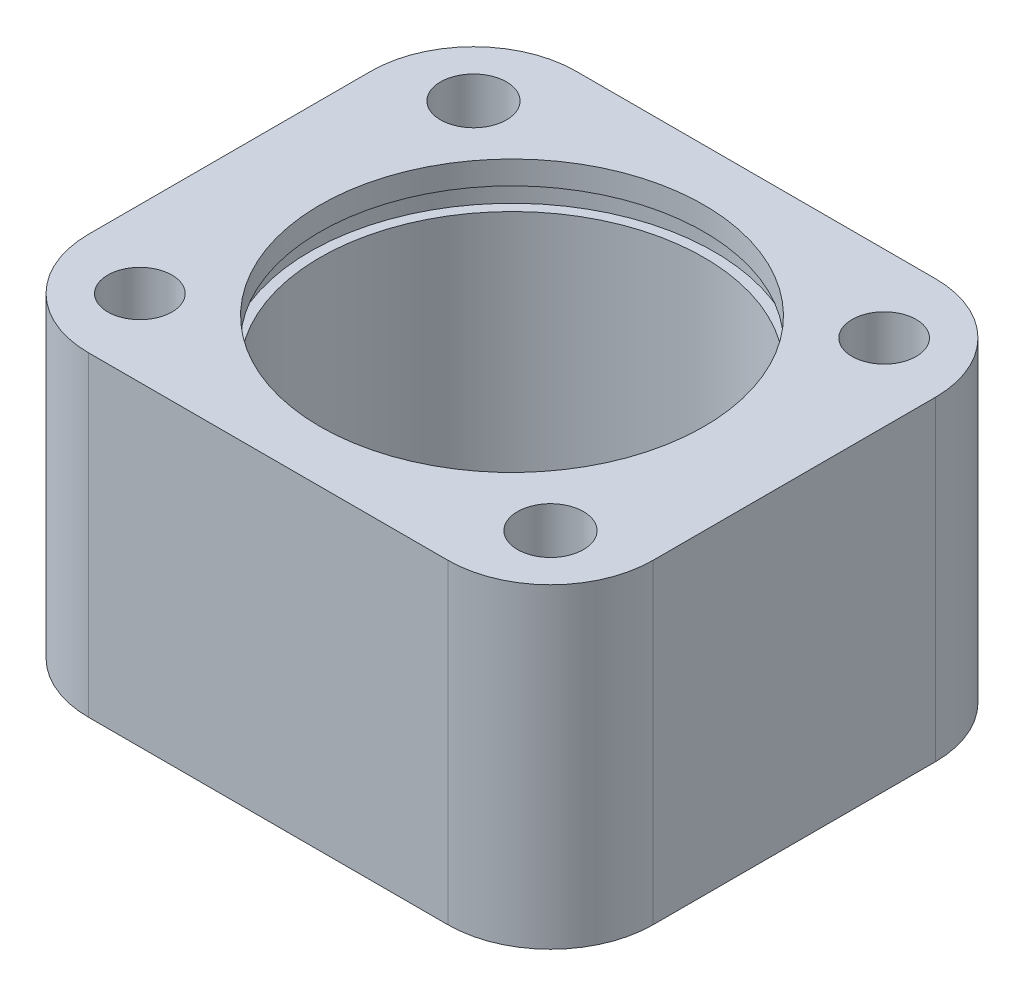
ISO-10303-21;
HEADER;
FILE_DESCRIPTION(('STEP AP214'),'2;1');
FILE_NAME('part.step','',(''),(''),'','','');
FILE_SCHEMA(('AUTOMOTIVE_DESIGN { 1 0 10303 214 1 1 1 1 }'));
ENDSEC;
DATA;
#1=APPLICATION_CONTEXT('core data for automotive mechanical design processes');
#2=APPLICATION_PROTOCOL_DEFINITION('international standard','automotive_design',2000,#1);
#3=PRODUCT_CONTEXT('',#1,'mechanical');
#4=PRODUCT('Part','Part','',(#3));
#5=PRODUCT_RELATED_PRODUCT_CATEGORY('part','',(#4));
#6=PRODUCT_DEFINITION_FORMATION('','',#4);
#7=PRODUCT_DEFINITION_CONTEXT('part definition',#1,'design');
#8=PRODUCT_DEFINITION('design','',#6,#7);
#9=PRODUCT_DEFINITION_SHAPE('','',#8);
#10=(LENGTH_UNIT() NAMED_UNIT(*) SI_UNIT(.MILLI.,.METRE.));
#11=(NAMED_UNIT(*) PLANE_ANGLE_UNIT() SI_UNIT($,.RADIAN.));
#12=(NAMED_UNIT(*) SI_UNIT($,.STERADIAN.) SOLID_ANGLE_UNIT());
#13=UNCERTAINTY_MEASURE_WITH_UNIT(LENGTH_MEASURE(1.E-05),#10,'distance_accuracy_value','');
#14=(GEOMETRIC_REPRESENTATION_CONTEXT(3) GLOBAL_UNCERTAINTY_ASSIGNED_CONTEXT((#13)) GLOBAL_UNIT_ASSIGNED_CONTEXT((#10,
#11,#12)) REPRESENTATION_CONTEXT('',''));
#15=CARTESIAN_POINT('',(0.,0.,0.));
#16=DIRECTION('',(0.,0.,1.));
#17=DIRECTION('',(1.,0.,0.));
#18=AXIS2_PLACEMENT_3D('',#15,#16,#17);
#19=CARTESIAN_POINT('',(0.,-34.6794263142389,0.));
#20=DIRECTION('',(0.,1.,0.));
#21=DIRECTION('',(0.,0.,1.));
#22=AXIS2_PLACEMENT_3D('',#19,#20,#21);
#23=CYLINDRICAL_SURFACE('',#22,9.4996);
#24=CARTESIAN_POINT('',(0.,-6.5405,0.));
#25=DIRECTION('',(0.,1.,0.));
#26=DIRECTION('',(0.,0.,1.));
#27=AXIS2_PLACEMENT_3D('',#24,#25,#26);
#28=CIRCLE('',#27,9.4996);
#29=CARTESIAN_POINT('',(0.,-6.5405,9.4996));
#30=VERTEX_POINT('',#29);
#31=EDGE_CURVE('E226',#30,#30,#28,.F.);
#32=ORIENTED_EDGE('',*,*,#31,.T.);
#33=EDGE_LOOP('',(#32));
#34=FACE_BOUND('',#33,.T.);
#35=CARTESIAN_POINT('',(0.,5.5595,0.));
#36=DIRECTION('',(0.,1.,0.));
#37=DIRECTION('',(0.,0.,1.));
#38=AXIS2_PLACEMENT_3D('',#35,#36,#37);
#39=CIRCLE('',#38,9.4996);
#40=CARTESIAN_POINT('',(0.,5.5595,9.4996));
#41=VERTEX_POINT('',#40);
#42=EDGE_CURVE('E168',#41,#41,#39,.F.);
#43=ORIENTED_EDGE('',*,*,#42,.F.);
#44=EDGE_LOOP('',(#43));
#45=FACE_BOUND('',#44,.T.);
#46=ADVANCED_FACE('F39',(#34,#45),#23,.F.);
#47=CARTESIAN_POINT('',(13.97,-7.8105,12.065));
#48=DIRECTION('',(-1.,0.,0.));
#49=DIRECTION('',(0.,0.,1.));
#50=AXIS2_PLACEMENT_3D('',#47,#48,#49);
#51=PLANE('',#50);
#52=DIRECTION('',(0.,0.,-1.));
#53=VECTOR('',#52,1.);
#54=CARTESIAN_POINT('',(13.97,-7.8105,12.065));
#55=LINE('',#54,#53);
#56=CARTESIAN_POINT('',(13.97,-7.8105,6.985));
#57=VERTEX_POINT('',#56);
#58=CARTESIAN_POINT('',(13.97,-7.8105,-6.98499999999999));
#59=VERTEX_POINT('',#58);
#60=EDGE_CURVE('E129',#57,#59,#55,.T.);
#61=ORIENTED_EDGE('',*,*,#60,.T.);
#62=DIRECTION('',(0.,1.,0.));
#63=VECTOR('',#62,1.);
#64=CARTESIAN_POINT('',(13.97,7.8105,-6.985));
#65=LINE('',#64,#63);
#66=CARTESIAN_POINT('',(13.97,7.8105,-6.98499999999999));
#67=VERTEX_POINT('',#66);
#68=EDGE_CURVE('E156',#59,#67,#65,.T.);
#69=ORIENTED_EDGE('',*,*,#68,.T.);
#70=DIRECTION('',(0.,0.,-1.));
#71=VECTOR('',#70,1.);
#72=CARTESIAN_POINT('',(13.97,7.8105,12.065));
#73=LINE('',#72,#71);
#74=CARTESIAN_POINT('',(13.97,7.8105,6.985));
#75=VERTEX_POINT('',#74);
#76=EDGE_CURVE('E133',#75,#67,#73,.T.);
#77=ORIENTED_EDGE('',*,*,#76,.F.);
#78=DIRECTION('',(0.,1.,0.));
#79=VECTOR('',#78,1.);
#80=CARTESIAN_POINT('',(13.97,-7.8105,6.985));
#81=LINE('',#80,#79);
#82=EDGE_CURVE('E154',#75,#57,#81,.F.);
#83=ORIENTED_EDGE('',*,*,#82,.T.);
#84=EDGE_LOOP('',(#61,#69,#77,#83));
#85=FACE_BOUND('',#84,.T.);
#86=ADVANCED_FACE('F254',(#85),#51,.F.);
#87=CARTESIAN_POINT('',(-13.97,7.8105,12.065));
#88=DIRECTION('',(0.,-1.,0.));
#89=DIRECTION('',(0.,0.,-1.));
#90=AXIS2_PLACEMENT_3D('',#87,#88,#89);
#91=PLANE('',#90);
#92=CARTESIAN_POINT('',(-10.16,7.8105,8.255));
#93=DIRECTION('',(0.,-1.,0.));
#94=DIRECTION('',(0.,0.,-1.));
#95=AXIS2_PLACEMENT_3D('',#92,#93,#94);
#96=CIRCLE('',#95,1.5875);
#97=CARTESIAN_POINT('',(-10.16,7.8105,6.6675));
#98=VERTEX_POINT('',#97);
#99=EDGE_CURVE('E162',#98,#98,#96,.T.);
#100=ORIENTED_EDGE('',*,*,#99,.T.);
#101=EDGE_LOOP('',(#100));
#102=FACE_BOUND('',#101,.T.);
#103=CARTESIAN_POINT('',(10.16,7.8105,-8.255));
#104=DIRECTION('',(0.,-1.,0.));
#105=DIRECTION('',(0.,0.,-1.));
#106=AXIS2_PLACEMENT_3D('',#103,#104,#105);
#107=CIRCLE('',#106,1.5875);
#108=CARTESIAN_POINT('',(10.16,7.8105,-9.8425));
#109=VERTEX_POINT('',#108);
#110=EDGE_CURVE('E193',#109,#109,#107,.T.);
#111=ORIENTED_EDGE('',*,*,#110,.T.);
#112=EDGE_LOOP('',(#111));
#113=FACE_BOUND('',#112,.T.);
#114=CARTESIAN_POINT('',(10.16,7.8105,8.255));
#115=DIRECTION('',(0.,-1.,0.));
#116=DIRECTION('',(0.,0.,-1.));
#117=AXIS2_PLACEMENT_3D('',#114,#115,#116);
#118=CIRCLE('',#117,1.63195);
#119=CARTESIAN_POINT('',(10.16,7.8105,6.62305));
#120=VERTEX_POINT('',#119);
#121=EDGE_CURVE('E205',#120,#120,#118,.T.);
#122=ORIENTED_EDGE('',*,*,#121,.T.);
#123=EDGE_LOOP('',(#122));
#124=FACE_BOUND('',#123,.T.);
#125=CARTESIAN_POINT('',(-10.16,7.8105,-8.255));
#126=DIRECTION('',(0.,-1.,0.));
#127=DIRECTION('',(0.,0.,-1.));
#128=AXIS2_PLACEMENT_3D('',#125,#126,#127);
#129=CIRCLE('',#128,1.63195);
#130=CARTESIAN_POINT('',(-10.16,7.8105,-9.88695));
#131=VERTEX_POINT('',#130);
#132=EDGE_CURVE('E217',#131,#131,#129,.T.);
#133=ORIENTED_EDGE('',*,*,#132,.T.);
#134=EDGE_LOOP('',(#133));
#135=FACE_BOUND('',#134,.T.);
#136=CARTESIAN_POINT('',(0.,7.8105,0.));
#137=DIRECTION('',(0.,1.,0.));
#138=DIRECTION('',(0.,0.,1.));
#139=AXIS2_PLACEMENT_3D('',#136,#137,#138);
#140=CIRCLE('',#139,9.4996);
#141=CARTESIAN_POINT('',(0.,7.8105,9.4996));
#142=VERTEX_POINT('',#141);
#143=EDGE_CURVE('E223',#142,#142,#140,.T.);
#144=ORIENTED_EDGE('',*,*,#143,.F.);
#145=EDGE_LOOP('',(#144));
#146=FACE_BOUND('',#145,.T.);
#147=DIRECTION('',(-1.,0.,0.));
#148=VECTOR('',#147,1.);
#149=CARTESIAN_POINT('',(-13.97,7.8105,-12.065));
#150=LINE('',#149,#148);
#151=CARTESIAN_POINT('',(8.89,7.8105,-12.065));
#152=VERTEX_POINT('',#151);
#153=CARTESIAN_POINT('',(-8.89,7.8105,-12.065));
#154=VERTEX_POINT('',#153);
#155=EDGE_CURVE('E229',#152,#154,#150,.T.);
#156=ORIENTED_EDGE('',*,*,#155,.T.);
#157=CARTESIAN_POINT('',(-8.89,7.8105,-6.985));
#158=DIRECTION('',(0.,-1.,0.));
#159=DIRECTION('',(0.,0.,-1.));
#160=AXIS2_PLACEMENT_3D('',#157,#158,#159);
#161=CIRCLE('',#160,5.08);
#162=CARTESIAN_POINT('',(-13.97,7.8105,-6.98499999999999));
#163=VERTEX_POINT('',#162);
#164=EDGE_CURVE('E152',#154,#163,#161,.F.);
#165=ORIENTED_EDGE('',*,*,#164,.T.);
#166=DIRECTION('',(0.,0.,-1.));
#167=VECTOR('',#166,1.);
#168=CARTESIAN_POINT('',(-13.97,7.8105,12.065));
#169=LINE('',#168,#167);
#170=CARTESIAN_POINT('',(-13.97,7.8105,6.985));
#171=VERTEX_POINT('',#170);
#172=EDGE_CURVE('E128',#171,#163,#169,.T.);
#173=ORIENTED_EDGE('',*,*,#172,.F.);
#174=CARTESIAN_POINT('',(-8.89,7.8105,6.985));
#175=DIRECTION('',(0.,-1.,0.));
#176=DIRECTION('',(0.,0.,-1.));
#177=AXIS2_PLACEMENT_3D('',#174,#175,#176);
#178=CIRCLE('',#177,5.08);
#179=CARTESIAN_POINT('',(-8.89,7.8105,12.065));
#180=VERTEX_POINT('',#179);
#181=EDGE_CURVE('E132',#171,#180,#178,.F.);
#182=ORIENTED_EDGE('',*,*,#181,.T.);
#183=DIRECTION('',(-1.,0.,0.));
#184=VECTOR('',#183,1.);
#185=CARTESIAN_POINT('',(-13.97,7.8105,12.065));
#186=LINE('',#185,#184);
#187=CARTESIAN_POINT('',(8.89,7.8105,12.065));
#188=VERTEX_POINT('',#187);
#189=EDGE_CURVE('E230',#188,#180,#186,.T.);
#190=ORIENTED_EDGE('',*,*,#189,.F.);
#191=CARTESIAN_POINT('',(8.89,7.8105,6.985));
#192=DIRECTION('',(0.,-1.,0.));
#193=DIRECTION('',(0.,0.,-1.));
#194=AXIS2_PLACEMENT_3D('',#191,#192,#193);
#195=CIRCLE('',#194,5.08);
#196=EDGE_CURVE('E64',#188,#75,#195,.F.);
#197=ORIENTED_EDGE('',*,*,#196,.T.);
#198=ORIENTED_EDGE('',*,*,#76,.T.);
#199=CARTESIAN_POINT('',(8.89,7.8105,-6.985));
#200=DIRECTION('',(0.,-1.,0.));
#201=DIRECTION('',(0.,0.,-1.));
#202=AXIS2_PLACEMENT_3D('',#199,#200,#201);
#203=CIRCLE('',#202,5.08);
#204=EDGE_CURVE('E56',#67,#152,#203,.F.);
#205=ORIENTED_EDGE('',*,*,#204,.T.);
#206=EDGE_LOOP('',(#156,#165,#173,#182,#190,#197,#198,#205));
#207=FACE_BOUND('',#206,.T.);
#208=ADVANCED_FACE('F261',(#102,#113,#124,#135,#146,#207),#91,.F.);
#209=CARTESIAN_POINT('',(-13.97,-7.8105,12.065));
#210=DIRECTION('',(1.,0.,0.));
#211=DIRECTION('',(0.,0.,-1.));
#212=AXIS2_PLACEMENT_3D('',#209,#210,#211);
#213=PLANE('',#212);
#214=ORIENTED_EDGE('',*,*,#172,.T.);
#215=DIRECTION('',(0.,-1.,0.));
#216=VECTOR('',#215,1.);
#217=CARTESIAN_POINT('',(-13.97,-7.8105,-6.985));
#218=LINE('',#217,#216);
#219=CARTESIAN_POINT('',(-13.97,-7.8105,-6.98499999999999));
#220=VERTEX_POINT('',#219);
#221=EDGE_CURVE('E119',#163,#220,#218,.T.);
#222=ORIENTED_EDGE('',*,*,#221,.T.);
#223=DIRECTION('',(0.,0.,-1.));
#224=VECTOR('',#223,1.);
#225=CARTESIAN_POINT('',(-13.97,-7.8105,12.065));
#226=LINE('',#225,#224);
#227=CARTESIAN_POINT('',(-13.97,-7.8105,6.985));
#228=VERTEX_POINT('',#227);
#229=EDGE_CURVE('E111',#228,#220,#226,.T.);
#230=ORIENTED_EDGE('',*,*,#229,.F.);
#231=DIRECTION('',(0.,-1.,0.));
#232=VECTOR('',#231,1.);
#233=CARTESIAN_POINT('',(-13.97,-7.8105,6.985));
#234=LINE('',#233,#232);
#235=EDGE_CURVE('E125',#228,#171,#234,.F.);
#236=ORIENTED_EDGE('',*,*,#235,.T.);
#237=EDGE_LOOP('',(#214,#222,#230,#236));
#238=FACE_BOUND('',#237,.T.);
#239=ADVANCED_FACE('F124',(#238),#213,.F.);
#240=CARTESIAN_POINT('',(-13.97,-7.8105,12.065));
#241=DIRECTION('',(0.,1.,0.));
#242=DIRECTION('',(0.,0.,1.));
#243=AXIS2_PLACEMENT_3D('',#240,#241,#242);
#244=PLANE('',#243);
#245=CARTESIAN_POINT('',(-10.16,-7.8105,8.255));
#246=DIRECTION('',(0.,-1.,0.));
#247=DIRECTION('',(0.,0.,-1.));
#248=AXIS2_PLACEMENT_3D('',#245,#246,#247);
#249=CIRCLE('',#248,1.98437499999999);
#250=CARTESIAN_POINT('',(-10.16,-7.8105,6.27062500000001));
#251=VERTEX_POINT('',#250);
#252=EDGE_CURVE('E174',#251,#251,#249,.T.);
#253=ORIENTED_EDGE('',*,*,#252,.F.);
#254=EDGE_LOOP('',(#253));
#255=FACE_BOUND('',#254,.T.);
#256=CARTESIAN_POINT('',(10.16,-7.8105,-8.255));
#257=DIRECTION('',(0.,-1.,0.));
#258=DIRECTION('',(0.,0.,-1.));
#259=AXIS2_PLACEMENT_3D('',#256,#257,#258);
#260=CIRCLE('',#259,1.98437499999999);
#261=CARTESIAN_POINT('',(10.16,-7.8105,-10.239375));
#262=VERTEX_POINT('',#261);
#263=EDGE_CURVE('E166',#262,#262,#260,.T.);
#264=ORIENTED_EDGE('',*,*,#263,.F.);
#265=EDGE_LOOP('',(#264));
#266=FACE_BOUND('',#265,.T.);
#267=CARTESIAN_POINT('',(10.16,-7.8105,8.255));
#268=DIRECTION('',(0.,-1.,0.));
#269=DIRECTION('',(0.,0.,-1.));
#270=AXIS2_PLACEMENT_3D('',#267,#268,#269);
#271=CIRCLE('',#270,2.77875999999999);
#272=CARTESIAN_POINT('',(10.16,-7.8105,5.47624000000001));
#273=VERTEX_POINT('',#272);
#274=EDGE_CURVE('E196',#273,#273,#271,.T.);
#275=ORIENTED_EDGE('',*,*,#274,.F.);
#276=EDGE_LOOP('',(#275));
#277=FACE_BOUND('',#276,.T.);
#278=CARTESIAN_POINT('',(-10.16,-7.8105,-8.255));
#279=DIRECTION('',(0.,-1.,0.));
#280=DIRECTION('',(0.,0.,-1.));
#281=AXIS2_PLACEMENT_3D('',#278,#279,#280);
#282=CIRCLE('',#281,2.77875999999999);
#283=CARTESIAN_POINT('',(-10.16,-7.8105,-11.03376));
#284=VERTEX_POINT('',#283);
#285=EDGE_CURVE('E208',#284,#284,#282,.T.);
#286=ORIENTED_EDGE('',*,*,#285,.F.);
#287=EDGE_LOOP('',(#286));
#288=FACE_BOUND('',#287,.T.);
#289=CARTESIAN_POINT('',(0.,-7.8105,0.));
#290=DIRECTION('',(0.,1.,0.));
#291=DIRECTION('',(0.,0.,1.));
#292=AXIS2_PLACEMENT_3D('',#289,#290,#291);
#293=CIRCLE('',#292,7.50062);
#294=CARTESIAN_POINT('',(0.,-7.8105,7.50062));
#295=VERTEX_POINT('',#294);
#296=EDGE_CURVE('E220',#295,#295,#293,.T.);
#297=ORIENTED_EDGE('',*,*,#296,.T.);
#298=EDGE_LOOP('',(#297));
#299=FACE_BOUND('',#298,.T.);
#300=ORIENTED_EDGE('',*,*,#229,.T.);
#301=CARTESIAN_POINT('',(-8.89,-7.8105,-6.985));
#302=DIRECTION('',(0.,1.,0.));
#303=DIRECTION('',(0.,0.,1.));
#304=AXIS2_PLACEMENT_3D('',#301,#302,#303);
#305=CIRCLE('',#304,5.08);
#306=CARTESIAN_POINT('',(-8.89,-7.8105,-12.065));
#307=VERTEX_POINT('',#306);
#308=EDGE_CURVE('E143',#220,#307,#305,.F.);
#309=ORIENTED_EDGE('',*,*,#308,.T.);
#310=DIRECTION('',(1.,0.,0.));
#311=VECTOR('',#310,1.);
#312=CARTESIAN_POINT('',(-13.97,-7.8105,-12.065));
#313=LINE('',#312,#311);
#314=CARTESIAN_POINT('',(8.89,-7.8105,-12.065));
#315=VERTEX_POINT('',#314);
#316=EDGE_CURVE('E233',#307,#315,#313,.T.);
#317=ORIENTED_EDGE('',*,*,#316,.T.);
#318=CARTESIAN_POINT('',(8.89,-7.8105,-6.985));
#319=DIRECTION('',(0.,1.,0.));
#320=DIRECTION('',(0.,0.,1.));
#321=AXIS2_PLACEMENT_3D('',#318,#319,#320);
#322=CIRCLE('',#321,5.08);
#323=EDGE_CURVE('E141',#315,#59,#322,.F.);
#324=ORIENTED_EDGE('',*,*,#323,.T.);
#325=ORIENTED_EDGE('',*,*,#60,.F.);
#326=CARTESIAN_POINT('',(8.89,-7.8105,6.985));
#327=DIRECTION('',(0.,1.,0.));
#328=DIRECTION('',(0.,0.,1.));
#329=AXIS2_PLACEMENT_3D('',#326,#327,#328);
#330=CIRCLE('',#329,5.08);
#331=CARTESIAN_POINT('',(8.89,-7.8105,12.065));
#332=VERTEX_POINT('',#331);
#333=EDGE_CURVE('E118',#57,#332,#330,.F.);
#334=ORIENTED_EDGE('',*,*,#333,.T.);
#335=DIRECTION('',(1.,0.,0.));
#336=VECTOR('',#335,1.);
#337=CARTESIAN_POINT('',(-13.97,-7.8105,12.065));
#338=LINE('',#337,#336);
#339=CARTESIAN_POINT('',(-8.89,-7.8105,12.065));
#340=VERTEX_POINT('',#339);
#341=EDGE_CURVE('E113',#340,#332,#338,.T.);
#342=ORIENTED_EDGE('',*,*,#341,.F.);
#343=CARTESIAN_POINT('',(-8.89,-7.8105,6.985));
#344=DIRECTION('',(0.,1.,0.));
#345=DIRECTION('',(0.,0.,1.));
#346=AXIS2_PLACEMENT_3D('',#343,#344,#345);
#347=CIRCLE('',#346,5.08);
#348=EDGE_CURVE('E108',#340,#228,#347,.F.);
#349=ORIENTED_EDGE('',*,*,#348,.T.);
#350=EDGE_LOOP('',(#300,#309,#317,#324,#325,#334,#342,#349));
#351=FACE_BOUND('',#350,.T.);
#352=ADVANCED_FACE('F110',(#255,#266,#277,#288,#299,#351),#244,.F.);
#353=CARTESIAN_POINT('',(0.,0.,12.065));
#354=DIRECTION('',(0.,0.,-1.));
#355=DIRECTION('',(-1.,0.,0.));
#356=AXIS2_PLACEMENT_3D('',#353,#354,#355);
#357=PLANE('',#356);
#358=ORIENTED_EDGE('',*,*,#341,.T.);
#359=DIRECTION('',(0.,1.,0.));
#360=VECTOR('',#359,1.);
#361=CARTESIAN_POINT('',(8.89,0.,12.065));
#362=LINE('',#361,#360);
#363=EDGE_CURVE('E12',#332,#188,#362,.T.);
#364=ORIENTED_EDGE('',*,*,#363,.T.);
#365=ORIENTED_EDGE('',*,*,#189,.T.);
#366=DIRECTION('',(0.,-1.,0.));
#367=VECTOR('',#366,1.);
#368=CARTESIAN_POINT('',(-8.89,0.,12.065));
#369=LINE('',#368,#367);
#370=EDGE_CURVE('E48',#180,#340,#369,.T.);
#371=ORIENTED_EDGE('',*,*,#370,.T.);
#372=EDGE_LOOP('',(#358,#364,#365,#371));
#373=FACE_BOUND('',#372,.T.);
#374=ADVANCED_FACE('F260',(#373),#357,.F.);
#375=CARTESIAN_POINT('',(0.,0.,-12.065));
#376=DIRECTION('',(0.,0.,-1.));
#377=DIRECTION('',(-1.,0.,0.));
#378=AXIS2_PLACEMENT_3D('',#375,#376,#377);
#379=PLANE('',#378);
#380=ORIENTED_EDGE('',*,*,#316,.F.);
#381=DIRECTION('',(0.,-1.,0.));
#382=VECTOR('',#381,1.);
#383=CARTESIAN_POINT('',(-8.89,7.8105,-12.065));
#384=LINE('',#383,#382);
#385=EDGE_CURVE('E147',#307,#154,#384,.F.);
#386=ORIENTED_EDGE('',*,*,#385,.T.);
#387=ORIENTED_EDGE('',*,*,#155,.F.);
#388=DIRECTION('',(0.,1.,0.));
#389=VECTOR('',#388,1.);
#390=CARTESIAN_POINT('',(8.89,-7.8105,-12.065));
#391=LINE('',#390,#389);
#392=EDGE_CURVE('E145',#152,#315,#391,.F.);
#393=ORIENTED_EDGE('',*,*,#392,.T.);
#394=EDGE_LOOP('',(#380,#386,#387,#393));
#395=FACE_BOUND('',#394,.T.);
#396=ADVANCED_FACE('F248',(#395),#379,.T.);
#397=CARTESIAN_POINT('',(0.,6.6595,0.));
#398=DIRECTION('',(0.,1.,0.));
#399=DIRECTION('',(0.,0.,1.));
#400=AXIS2_PLACEMENT_3D('',#397,#398,#399);
#401=CIRCLE('',#400,9.4996);
#402=CARTESIAN_POINT('',(0.,6.6595,9.4996));
#403=VERTEX_POINT('',#402);
#404=EDGE_CURVE('E43',#403,#403,#401,.F.);
#405=ORIENTED_EDGE('',*,*,#404,.T.);
#406=EDGE_LOOP('',(#405));
#407=FACE_BOUND('',#406,.T.);
#408=ORIENTED_EDGE('',*,*,#143,.T.);
#409=EDGE_LOOP('',(#408));
#410=FACE_BOUND('',#409,.T.);
#411=ADVANCED_FACE('F275',(#407,#410),#23,.F.);
#412=CARTESIAN_POINT('',(-13.97,-6.5405,12.065));
#413=DIRECTION('',(0.,1.,0.));
#414=DIRECTION('',(0.,0.,1.));
#415=AXIS2_PLACEMENT_3D('',#412,#413,#414);
#416=PLANE('',#415);
#417=CARTESIAN_POINT('',(0.,-6.5405,0.));
#418=DIRECTION('',(0.,1.,0.));
#419=DIRECTION('',(0.,0.,1.));
#420=AXIS2_PLACEMENT_3D('',#417,#418,#419);
#421=CIRCLE('',#420,7.50062);
#422=CARTESIAN_POINT('',(0.,-6.5405,7.50062));
#423=VERTEX_POINT('',#422);
#424=EDGE_CURVE('E138',#423,#423,#421,.T.);
#425=ORIENTED_EDGE('',*,*,#424,.F.);
#426=EDGE_LOOP('',(#425));
#427=FACE_BOUND('',#426,.T.);
#428=ORIENTED_EDGE('',*,*,#31,.F.);
#429=EDGE_LOOP('',(#428));
#430=FACE_BOUND('',#429,.T.);
#431=ADVANCED_FACE('F282',(#427,#430),#416,.T.);
#432=CARTESIAN_POINT('',(0.,-7.8105,0.));
#433=DIRECTION('',(0.,1.,0.));
#434=DIRECTION('',(0.,0.,1.));
#435=AXIS2_PLACEMENT_3D('',#432,#433,#434);
#436=CYLINDRICAL_SURFACE('',#435,7.50062);
#437=ORIENTED_EDGE('',*,*,#424,.T.);
#438=EDGE_LOOP('',(#437));
#439=FACE_BOUND('',#438,.T.);
#440=ORIENTED_EDGE('',*,*,#296,.F.);
#441=EDGE_LOOP('',(#440));
#442=FACE_BOUND('',#441,.T.);
#443=ADVANCED_FACE('F288',(#439,#442),#436,.F.);
#444=CARTESIAN_POINT('',(-10.16,-7.8105,-8.255));
#445=DIRECTION('',(0.,-1.,0.));
#446=DIRECTION('',(0.,0.,-1.));
#447=AXIS2_PLACEMENT_3D('',#444,#445,#446);
#448=CYLINDRICAL_SURFACE('',#447,1.63195);
#449=ORIENTED_EDGE('',*,*,#132,.F.);
#450=EDGE_LOOP('',(#449));
#451=FACE_BOUND('',#450,.T.);
#452=CARTESIAN_POINT('',(-10.16,-4.9657,-8.255));
#453=DIRECTION('',(0.,-1.,0.));
#454=DIRECTION('',(0.,0.,-1.));
#455=AXIS2_PLACEMENT_3D('',#452,#453,#454);
#456=CIRCLE('',#455,1.63195);
#457=CARTESIAN_POINT('',(-10.16,-4.9657,-9.88695));
#458=VERTEX_POINT('',#457);
#459=EDGE_CURVE('E214',#458,#458,#456,.T.);
#460=ORIENTED_EDGE('',*,*,#459,.T.);
#461=EDGE_LOOP('',(#460));
#462=FACE_BOUND('',#461,.T.);
#463=ADVANCED_FACE('F353',(#451,#462),#448,.F.);
#464=CARTESIAN_POINT('',(-8.52805,-4.9657,-8.255));
#465=DIRECTION('',(0.,1.,0.));
#466=DIRECTION('',(0.,0.,1.));
#467=AXIS2_PLACEMENT_3D('',#464,#465,#466);
#468=PLANE('',#467);
#469=ORIENTED_EDGE('',*,*,#459,.F.);
#470=EDGE_LOOP('',(#469));
#471=FACE_BOUND('',#470,.T.);
#472=CARTESIAN_POINT('',(-10.16,-4.9657,-8.255));
#473=DIRECTION('',(0.,-1.,0.));
#474=DIRECTION('',(0.,0.,-1.));
#475=AXIS2_PLACEMENT_3D('',#472,#473,#474);
#476=CIRCLE('',#475,2.77876);
#477=CARTESIAN_POINT('',(-10.16,-4.9657,-11.03376));
#478=VERTEX_POINT('',#477);
#479=EDGE_CURVE('E211',#478,#478,#476,.T.);
#480=ORIENTED_EDGE('',*,*,#479,.T.);
#481=EDGE_LOOP('',(#480));
#482=FACE_BOUND('',#481,.T.);
#483=ADVANCED_FACE('F349',(#471,#482),#468,.F.);
#484=CARTESIAN_POINT('',(-10.16,-7.8105,-8.255));
#485=DIRECTION('',(0.,-1.,0.));
#486=DIRECTION('',(0.,0.,-1.));
#487=AXIS2_PLACEMENT_3D('',#484,#485,#486);
#488=CYLINDRICAL_SURFACE('',#487,2.77876);
#489=ORIENTED_EDGE('',*,*,#479,.F.);
#490=EDGE_LOOP('',(#489));
#491=FACE_BOUND('',#490,.T.);
#492=ORIENTED_EDGE('',*,*,#285,.T.);
#493=EDGE_LOOP('',(#492));
#494=FACE_BOUND('',#493,.T.);
#495=ADVANCED_FACE('F345',(#491,#494),#488,.F.);
#496=CARTESIAN_POINT('',(10.16,-7.8105,8.255));
#497=DIRECTION('',(0.,-1.,0.));
#498=DIRECTION('',(0.,0.,-1.));
#499=AXIS2_PLACEMENT_3D('',#496,#497,#498);
#500=CYLINDRICAL_SURFACE('',#499,1.63195);
#501=ORIENTED_EDGE('',*,*,#121,.F.);
#502=EDGE_LOOP('',(#501));
#503=FACE_BOUND('',#502,.T.);
#504=CARTESIAN_POINT('',(10.16,-4.9657,8.255));
#505=DIRECTION('',(0.,-1.,0.));
#506=DIRECTION('',(0.,0.,-1.));
#507=AXIS2_PLACEMENT_3D('',#504,#505,#506);
#508=CIRCLE('',#507,1.63195);
#509=CARTESIAN_POINT('',(10.16,-4.9657,6.62305));
#510=VERTEX_POINT('',#509);
#511=EDGE_CURVE('E202',#510,#510,#508,.T.);
#512=ORIENTED_EDGE('',*,*,#511,.T.);
#513=EDGE_LOOP('',(#512));
#514=FACE_BOUND('',#513,.T.);
#515=ADVANCED_FACE('F341',(#503,#514),#500,.F.);
#516=CARTESIAN_POINT('',(11.79195,-4.9657,8.255));
#517=DIRECTION('',(0.,1.,0.));
#518=DIRECTION('',(0.,0.,1.));
#519=AXIS2_PLACEMENT_3D('',#516,#517,#518);
#520=PLANE('',#519);
#521=ORIENTED_EDGE('',*,*,#511,.F.);
#522=EDGE_LOOP('',(#521));
#523=FACE_BOUND('',#522,.T.);
#524=CARTESIAN_POINT('',(10.16,-4.9657,8.255));
#525=DIRECTION('',(0.,-1.,0.));
#526=DIRECTION('',(0.,0.,-1.));
#527=AXIS2_PLACEMENT_3D('',#524,#525,#526);
#528=CIRCLE('',#527,2.77876);
#529=CARTESIAN_POINT('',(10.16,-4.9657,5.47624));
#530=VERTEX_POINT('',#529);
#531=EDGE_CURVE('E199',#530,#530,#528,.T.);
#532=ORIENTED_EDGE('',*,*,#531,.T.);
#533=EDGE_LOOP('',(#532));
#534=FACE_BOUND('',#533,.T.);
#535=ADVANCED_FACE('F337',(#523,#534),#520,.F.);
#536=CARTESIAN_POINT('',(10.16,-7.8105,8.255));
#537=DIRECTION('',(0.,-1.,0.));
#538=DIRECTION('',(0.,0.,-1.));
#539=AXIS2_PLACEMENT_3D('',#536,#537,#538);
#540=CYLINDRICAL_SURFACE('',#539,2.77876);
#541=ORIENTED_EDGE('',*,*,#531,.F.);
#542=EDGE_LOOP('',(#541));
#543=FACE_BOUND('',#542,.T.);
#544=ORIENTED_EDGE('',*,*,#274,.T.);
#545=EDGE_LOOP('',(#544));
#546=FACE_BOUND('',#545,.T.);
#547=ADVANCED_FACE('F334',(#543,#546),#540,.F.);
#548=CARTESIAN_POINT('',(-8.89,-7.8105,-6.985));
#549=DIRECTION('',(0.,1.,0.));
#550=DIRECTION('',(0.,0.,1.));
#551=AXIS2_PLACEMENT_3D('',#548,#549,#550);
#552=CYLINDRICAL_SURFACE('',#551,5.08);
#553=ORIENTED_EDGE('',*,*,#164,.F.);
#554=ORIENTED_EDGE('',*,*,#385,.F.);
#555=ORIENTED_EDGE('',*,*,#308,.F.);
#556=ORIENTED_EDGE('',*,*,#221,.F.);
#557=EDGE_LOOP('',(#553,#554,#555,#556));
#558=FACE_BOUND('',#557,.T.);
#559=ADVANCED_FACE('F243',(#558),#552,.T.);
#560=CARTESIAN_POINT('',(8.89,-7.8105,-6.985));
#561=DIRECTION('',(0.,-1.,0.));
#562=DIRECTION('',(0.,0.,-1.));
#563=AXIS2_PLACEMENT_3D('',#560,#561,#562);
#564=CYLINDRICAL_SURFACE('',#563,5.08);
#565=ORIENTED_EDGE('',*,*,#323,.F.);
#566=ORIENTED_EDGE('',*,*,#392,.F.);
#567=ORIENTED_EDGE('',*,*,#204,.F.);
#568=ORIENTED_EDGE('',*,*,#68,.F.);
#569=EDGE_LOOP('',(#565,#566,#567,#568));
#570=FACE_BOUND('',#569,.T.);
#571=ADVANCED_FACE('F250',(#570),#564,.T.);
#572=CARTESIAN_POINT('',(8.89,0.,6.985));
#573=DIRECTION('',(0.,1.,0.));
#574=DIRECTION('',(0.,0.,1.));
#575=AXIS2_PLACEMENT_3D('',#572,#573,#574);
#576=CYLINDRICAL_SURFACE('',#575,5.08);
#577=ORIENTED_EDGE('',*,*,#333,.F.);
#578=ORIENTED_EDGE('',*,*,#82,.F.);
#579=ORIENTED_EDGE('',*,*,#196,.F.);
#580=ORIENTED_EDGE('',*,*,#363,.F.);
#581=EDGE_LOOP('',(#577,#578,#579,#580));
#582=FACE_BOUND('',#581,.T.);
#583=ADVANCED_FACE('F257',(#582),#576,.T.);
#584=CARTESIAN_POINT('',(-8.89,0.,6.985));
#585=DIRECTION('',(0.,-1.,0.));
#586=DIRECTION('',(0.,0.,-1.));
#587=AXIS2_PLACEMENT_3D('',#584,#585,#586);
#588=CYLINDRICAL_SURFACE('',#587,5.08);
#589=ORIENTED_EDGE('',*,*,#181,.F.);
#590=ORIENTED_EDGE('',*,*,#235,.F.);
#591=ORIENTED_EDGE('',*,*,#348,.F.);
#592=ORIENTED_EDGE('',*,*,#370,.F.);
#593=EDGE_LOOP('',(#589,#590,#591,#592));
#594=FACE_BOUND('',#593,.T.);
#595=ADVANCED_FACE('F41',(#594),#588,.T.);
#596=CARTESIAN_POINT('',(10.16,-7.8105,-8.255));
#597=DIRECTION('',(0.,-1.,0.));
#598=DIRECTION('',(0.,0.,-1.));
#599=AXIS2_PLACEMENT_3D('',#596,#597,#598);
#600=CYLINDRICAL_SURFACE('',#599,1.58749999999999);
#601=CARTESIAN_POINT('',(10.16,0.0479665581765653,-8.255));
#602=DIRECTION('',(0.,-1.,0.));
#603=DIRECTION('',(0.,0.,-1.));
#604=AXIS2_PLACEMENT_3D('',#601,#602,#603);
#605=CIRCLE('',#604,1.58749999999999);
#606=CARTESIAN_POINT('',(10.16,0.0479665581765653,-9.84249999999999));
#607=VERTEX_POINT('',#606);
#608=EDGE_CURVE('E159',#607,#607,#605,.T.);
#609=ORIENTED_EDGE('',*,*,#608,.T.);
#610=EDGE_LOOP('',(#609));
#611=FACE_BOUND('',#610,.T.);
#612=ORIENTED_EDGE('',*,*,#110,.F.);
#613=EDGE_LOOP('',(#612));
#614=FACE_BOUND('',#613,.T.);
#615=ADVANCED_FACE('F329',(#611,#614),#600,.F.);
#616=CARTESIAN_POINT('',(-10.16,-7.8105,8.255));
#617=DIRECTION('',(0.,-1.,0.));
#618=DIRECTION('',(0.,0.,-1.));
#619=AXIS2_PLACEMENT_3D('',#616,#617,#618);
#620=CYLINDRICAL_SURFACE('',#619,1.58749999999999);
#621=CARTESIAN_POINT('',(-10.16,0.0479665581765653,8.255));
#622=DIRECTION('',(0.,-1.,0.));
#623=DIRECTION('',(0.,0.,-1.));
#624=AXIS2_PLACEMENT_3D('',#621,#622,#623);
#625=CIRCLE('',#624,1.58749999999999);
#626=CARTESIAN_POINT('',(-10.16,0.0479665581765653,6.66750000000001));
#627=VERTEX_POINT('',#626);
#628=EDGE_CURVE('E164',#627,#627,#625,.T.);
#629=ORIENTED_EDGE('',*,*,#628,.T.);
#630=EDGE_LOOP('',(#629));
#631=FACE_BOUND('',#630,.T.);
#632=ORIENTED_EDGE('',*,*,#99,.F.);
#633=EDGE_LOOP('',(#632));
#634=FACE_BOUND('',#633,.T.);
#635=ADVANCED_FACE('F325',(#631,#634),#620,.F.);
#636=CARTESIAN_POINT('',(10.16,-0.190500000000001,-8.255));
#637=DIRECTION('',(0.,-1.,0.));
#638=DIRECTION('',(0.,0.,-1.));
#639=AXIS2_PLACEMENT_3D('',#636,#637,#638);
#640=CONICAL_SURFACE('',#639,1.984375,1.02974425867665);
#641=CARTESIAN_POINT('',(10.16,-0.190500000000001,-8.255));
#642=DIRECTION('',(0.,-1.,0.));
#643=DIRECTION('',(0.,0.,-1.));
#644=AXIS2_PLACEMENT_3D('',#641,#642,#643);
#645=CIRCLE('',#644,1.984375);
#646=CARTESIAN_POINT('',(10.16,-0.190500000000001,-10.239375));
#647=VERTEX_POINT('',#646);
#648=EDGE_CURVE('E163',#647,#647,#645,.T.);
#649=ORIENTED_EDGE('',*,*,#648,.T.);
#650=EDGE_LOOP('',(#649));
#651=FACE_BOUND('',#650,.T.);
#652=ORIENTED_EDGE('',*,*,#608,.F.);
#653=EDGE_LOOP('',(#652));
#654=FACE_BOUND('',#653,.T.);
#655=ADVANCED_FACE('F321',(#651,#654),#640,.F.);
#656=CARTESIAN_POINT('',(10.16,-7.8105,-8.255));
#657=DIRECTION('',(0.,-1.,0.));
#658=DIRECTION('',(0.,0.,-1.));
#659=AXIS2_PLACEMENT_3D('',#656,#657,#658);
#660=CYLINDRICAL_SURFACE('',#659,1.98437499999999);
#661=ORIENTED_EDGE('',*,*,#648,.F.);
#662=EDGE_LOOP('',(#661));
#663=FACE_BOUND('',#662,.T.);
#664=ORIENTED_EDGE('',*,*,#263,.T.);
#665=EDGE_LOOP('',(#664));
#666=FACE_BOUND('',#665,.T.);
#667=ADVANCED_FACE('F317',(#663,#666),#660,.F.);
#668=CARTESIAN_POINT('',(-10.16,-0.190500000000001,8.255));
#669=DIRECTION('',(0.,-1.,0.));
#670=DIRECTION('',(0.,0.,-1.));
#671=AXIS2_PLACEMENT_3D('',#668,#669,#670);
#672=CONICAL_SURFACE('',#671,1.984375,1.02974425867665);
#673=CARTESIAN_POINT('',(-10.16,-0.190500000000001,8.255));
#674=DIRECTION('',(0.,-1.,0.));
#675=DIRECTION('',(0.,0.,-1.));
#676=AXIS2_PLACEMENT_3D('',#673,#674,#675);
#677=CIRCLE('',#676,1.984375);
#678=CARTESIAN_POINT('',(-10.16,-0.190500000000001,6.270625));
#679=VERTEX_POINT('',#678);
#680=EDGE_CURVE('E167',#679,#679,#677,.T.);
#681=ORIENTED_EDGE('',*,*,#680,.T.);
#682=EDGE_LOOP('',(#681));
#683=FACE_BOUND('',#682,.T.);
#684=ORIENTED_EDGE('',*,*,#628,.F.);
#685=EDGE_LOOP('',(#684));
#686=FACE_BOUND('',#685,.T.);
#687=ADVANCED_FACE('F309',(#683,#686),#672,.F.);
#688=CARTESIAN_POINT('',(-10.16,-7.8105,8.255));
#689=DIRECTION('',(0.,-1.,0.));
#690=DIRECTION('',(0.,0.,-1.));
#691=AXIS2_PLACEMENT_3D('',#688,#689,#690);
#692=CYLINDRICAL_SURFACE('',#691,1.98437499999999);
#693=ORIENTED_EDGE('',*,*,#680,.F.);
#694=EDGE_LOOP('',(#693));
#695=FACE_BOUND('',#694,.T.);
#696=ORIENTED_EDGE('',*,*,#252,.T.);
#697=EDGE_LOOP('',(#696));
#698=FACE_BOUND('',#697,.T.);
#699=ADVANCED_FACE('F299',(#695,#698),#692,.F.);
#700=CARTESIAN_POINT('',(0.,6.6595,0.));
#701=DIRECTION('',(0.,1.,0.));
#702=DIRECTION('',(0.,0.,1.));
#703=AXIS2_PLACEMENT_3D('',#700,#701,#702);
#704=PLANE('',#703);
#705=CARTESIAN_POINT('',(0.,6.6595,0.));
#706=DIRECTION('',(0.,1.,0.));
#707=DIRECTION('',(0.,0.,1.));
#708=AXIS2_PLACEMENT_3D('',#705,#706,#707);
#709=CIRCLE('',#708,10.);
#710=CARTESIAN_POINT('',(0.,6.6595,10.));
#711=VERTEX_POINT('',#710);
#712=EDGE_CURVE('E170',#711,#711,#709,.T.);
#713=ORIENTED_EDGE('',*,*,#712,.F.);
#714=EDGE_LOOP('',(#713));
#715=FACE_BOUND('',#714,.T.);
#716=ORIENTED_EDGE('',*,*,#404,.F.);
#717=EDGE_LOOP('',(#716));
#718=FACE_BOUND('',#717,.T.);
#719=ADVANCED_FACE('F296',(#715,#718),#704,.F.);
#720=CARTESIAN_POINT('',(0.,5.5595,0.));
#721=DIRECTION('',(0.,1.,0.));
#722=DIRECTION('',(0.,0.,1.));
#723=AXIS2_PLACEMENT_3D('',#720,#721,#722);
#724=PLANE('',#723);
#725=CARTESIAN_POINT('',(0.,5.5595,0.));
#726=DIRECTION('',(0.,1.,0.));
#727=DIRECTION('',(0.,0.,1.));
#728=AXIS2_PLACEMENT_3D('',#725,#726,#727);
#729=CIRCLE('',#728,10.);
#730=CARTESIAN_POINT('',(0.,5.5595,10.));
#731=VERTEX_POINT('',#730);
#732=EDGE_CURVE('E176',#731,#731,#729,.T.);
#733=ORIENTED_EDGE('',*,*,#732,.T.);
#734=EDGE_LOOP('',(#733));
#735=FACE_BOUND('',#734,.T.);
#736=ORIENTED_EDGE('',*,*,#42,.T.);
#737=EDGE_LOOP('',(#736));
#738=FACE_BOUND('',#737,.T.);
#739=ADVANCED_FACE('F298',(#735,#738),#724,.T.);
#740=CARTESIAN_POINT('',(0.,6.6595,0.));
#741=DIRECTION('',(0.,-1.,0.));
#742=DIRECTION('',(0.,0.,-1.));
#743=AXIS2_PLACEMENT_3D('',#740,#741,#742);
#744=CYLINDRICAL_SURFACE('',#743,10.);
#745=ORIENTED_EDGE('',*,*,#712,.T.);
#746=EDGE_LOOP('',(#745));
#747=FACE_BOUND('',#746,.T.);
#748=ORIENTED_EDGE('',*,*,#732,.F.);
#749=EDGE_LOOP('',(#748));
#750=FACE_BOUND('',#749,.T.);
#751=ADVANCED_FACE('F306',(#747,#750),#744,.F.);
#752=CLOSED_SHELL('',(#46,#86,#208,#239,#352,#374,#396,#411,#431,#443,#463,#483,#495,#515,#535,
#547,#559,#571,#583,#595,#615,#635,#655,#667,#687,#699,#719,#739,#751));
#753=MANIFOLD_SOLID_BREP('B2',#752);
#754=ADVANCED_BREP_SHAPE_REPRESENTATION('',(#18,#753),#14);
#755=SHAPE_DEFINITION_REPRESENTATION(#9,#754);
ENDSEC;
END-ISO-10303-21;
